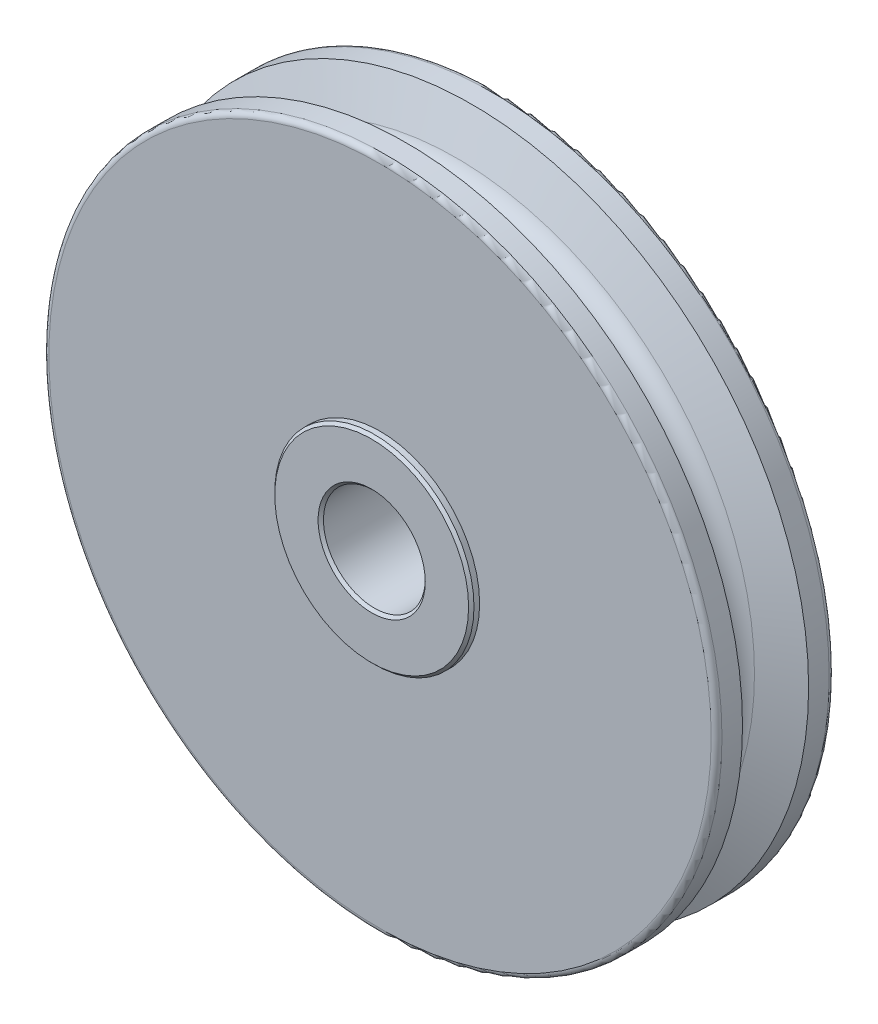
ISO-10303-21;
HEADER;
FILE_DESCRIPTION(('STEP AP214'),'2;1');
FILE_NAME('part.step','',(''),(''),'','','');
FILE_SCHEMA(('AUTOMOTIVE_DESIGN { 1 0 10303 214 1 1 1 1 }'));
ENDSEC;
DATA;
#1=APPLICATION_CONTEXT('core data for automotive mechanical design processes');
#2=APPLICATION_PROTOCOL_DEFINITION('international standard','automotive_design',2000,#1);
#3=PRODUCT_CONTEXT('',#1,'mechanical');
#4=PRODUCT('Part','Part','',(#3));
#5=PRODUCT_RELATED_PRODUCT_CATEGORY('part','',(#4));
#6=PRODUCT_DEFINITION_FORMATION('','',#4);
#7=PRODUCT_DEFINITION_CONTEXT('part definition',#1,'design');
#8=PRODUCT_DEFINITION('design','',#6,#7);
#9=PRODUCT_DEFINITION_SHAPE('','',#8);
#10=(LENGTH_UNIT() NAMED_UNIT(*) SI_UNIT(.MILLI.,.METRE.));
#11=(NAMED_UNIT(*) PLANE_ANGLE_UNIT() SI_UNIT($,.RADIAN.));
#12=(NAMED_UNIT(*) SI_UNIT($,.STERADIAN.) SOLID_ANGLE_UNIT());
#13=UNCERTAINTY_MEASURE_WITH_UNIT(LENGTH_MEASURE(1.E-05),#10,'distance_accuracy_value','');
#14=(GEOMETRIC_REPRESENTATION_CONTEXT(3) GLOBAL_UNCERTAINTY_ASSIGNED_CONTEXT((#13)) GLOBAL_UNIT_ASSIGNED_CONTEXT((#10,
#11,#12)) REPRESENTATION_CONTEXT('',''));
#15=CARTESIAN_POINT('',(0.,0.,0.));
#16=DIRECTION('',(0.,0.,1.));
#17=DIRECTION('',(1.,0.,0.));
#18=AXIS2_PLACEMENT_3D('',#15,#16,#17);
#19=CARTESIAN_POINT('',(0.,4.699,2.7813));
#20=DIRECTION('',(0.,0.,-1.));
#21=DIRECTION('',(-1.,0.,0.));
#22=AXIS2_PLACEMENT_3D('',#19,#20,#21);
#23=PLANE('',#22);
#24=CARTESIAN_POINT('',(0.,0.,2.7813));
#25=DIRECTION('',(0.,0.,1.));
#26=DIRECTION('',(1.,0.,0.));
#27=AXIS2_PLACEMENT_3D('',#24,#25,#26);
#28=CIRCLE('',#27,4.699);
#29=CARTESIAN_POINT('',(4.699,0.,2.7813));
#30=VERTEX_POINT('',#29);
#31=EDGE_CURVE('E74',#30,#30,#28,.T.);
#32=ORIENTED_EDGE('',*,*,#31,.F.);
#33=EDGE_LOOP('',(#32));
#34=FACE_BOUND('',#33,.T.);
#35=CARTESIAN_POINT('',(0.,0.,2.7813));
#36=DIRECTION('',(0.,0.,1.));
#37=DIRECTION('',(1.,0.,0.));
#38=AXIS2_PLACEMENT_3D('',#35,#36,#37);
#39=CIRCLE('',#38,15.621);
#40=CARTESIAN_POINT('',(15.621,0.,2.7813));
#41=VERTEX_POINT('',#40);
#42=EDGE_CURVE('E11',#41,#41,#39,.T.);
#43=ORIENTED_EDGE('',*,*,#42,.T.);
#44=EDGE_LOOP('',(#43));
#45=FACE_BOUND('',#44,.T.);
#46=ADVANCED_FACE('F40',(#34,#45),#23,.F.);
#47=CARTESIAN_POINT('',(0.,0.,2.5273));
#48=DIRECTION('',(0.,0.,1.));
#49=DIRECTION('',(1.,0.,0.));
#50=AXIS2_PLACEMENT_3D('',#47,#48,#49);
#51=TOROIDAL_SURFACE('',#50,15.621,0.253999999999999);
#52=ORIENTED_EDGE('',*,*,#42,.F.);
#53=EDGE_LOOP('',(#52));
#54=FACE_BOUND('',#53,.T.);
#55=CARTESIAN_POINT('',(0.,0.,2.5273));
#56=DIRECTION('',(0.,0.,1.));
#57=DIRECTION('',(1.,0.,0.));
#58=AXIS2_PLACEMENT_3D('',#55,#56,#57);
#59=CIRCLE('',#58,15.875);
#60=CARTESIAN_POINT('',(15.875,0.,2.5273));
#61=VERTEX_POINT('',#60);
#62=EDGE_CURVE('E46',#61,#61,#59,.T.);
#63=ORIENTED_EDGE('',*,*,#62,.T.);
#64=EDGE_LOOP('',(#63));
#65=FACE_BOUND('',#64,.T.);
#66=ADVANCED_FACE('F81',(#54,#65),#51,.T.);
#67=CARTESIAN_POINT('',(0.,0.,3.175));
#68=DIRECTION('',(0.,0.,1.));
#69=DIRECTION('',(1.,0.,0.));
#70=AXIS2_PLACEMENT_3D('',#67,#68,#69);
#71=CYLINDRICAL_SURFACE('',#70,15.875);
#72=ORIENTED_EDGE('',*,*,#62,.F.);
#73=EDGE_LOOP('',(#72));
#74=FACE_BOUND('',#73,.T.);
#75=CARTESIAN_POINT('',(0.,0.,1.55915995520883));
#76=DIRECTION('',(0.,0.,1.));
#77=DIRECTION('',(1.,0.,0.));
#78=AXIS2_PLACEMENT_3D('',#75,#76,#77);
#79=CIRCLE('',#78,15.875);
#80=CARTESIAN_POINT('',(15.875,0.,1.55915995520883));
#81=VERTEX_POINT('',#80);
#82=EDGE_CURVE('E50',#81,#81,#79,.T.);
#83=ORIENTED_EDGE('',*,*,#82,.T.);
#84=EDGE_LOOP('',(#83));
#85=FACE_BOUND('',#84,.T.);
#86=ADVANCED_FACE('F85',(#74,#85),#71,.T.);
#87=CARTESIAN_POINT('',(0.,0.,0.82426644670987));
#88=DIRECTION('',(0.,0.,1.));
#89=DIRECTION('',(1.,0.,0.));
#90=AXIS2_PLACEMENT_3D('',#87,#88,#89);
#91=CONICAL_SURFACE('',#90,14.0560747384533,1.18682389135614);
#92=ORIENTED_EDGE('',*,*,#82,.F.);
#93=EDGE_LOOP('',(#92));
#94=FACE_BOUND('',#93,.T.);
#95=CARTESIAN_POINT('',(0.,0.,0.82426644670987));
#96=DIRECTION('',(0.,0.,1.));
#97=DIRECTION('',(1.,0.,0.));
#98=AXIS2_PLACEMENT_3D('',#95,#96,#97);
#99=CIRCLE('',#98,14.0560747384533);
#100=CARTESIAN_POINT('',(14.0560747384533,0.,0.82426644670987));
#101=VERTEX_POINT('',#100);
#102=EDGE_CURVE('E54',#101,#101,#99,.T.);
#103=ORIENTED_EDGE('',*,*,#102,.T.);
#104=EDGE_LOOP('',(#103));
#105=FACE_BOUND('',#104,.T.);
#106=ADVANCED_FACE('F90',(#94,#105),#91,.T.);
#107=CARTESIAN_POINT('',(0.,0.,0.));
#108=DIRECTION('',(0.,0.,1.));
#109=DIRECTION('',(1.,0.,0.));
#110=AXIS2_PLACEMENT_3D('',#107,#108,#109);
#111=TOROIDAL_SURFACE('',#110,14.3891,0.888999999999999);
#112=ORIENTED_EDGE('',*,*,#102,.F.);
#113=EDGE_LOOP('',(#112));
#114=FACE_BOUND('',#113,.T.);
#115=CARTESIAN_POINT('',(0.,0.,-0.824266446709875));
#116=DIRECTION('',(0.,0.,1.));
#117=DIRECTION('',(1.,0.,0.));
#118=AXIS2_PLACEMENT_3D('',#115,#116,#117);
#119=CIRCLE('',#118,14.0560747384533);
#120=CARTESIAN_POINT('',(14.0560747384533,0.,-0.824266446709875));
#121=VERTEX_POINT('',#120);
#122=EDGE_CURVE('E59',#121,#121,#119,.T.);
#123=ORIENTED_EDGE('',*,*,#122,.T.);
#124=EDGE_LOOP('',(#123));
#125=FACE_BOUND('',#124,.T.);
#126=ADVANCED_FACE('F96',(#114,#125),#111,.F.);
#127=CARTESIAN_POINT('',(0.,0.,-1.55915995520883));
#128=DIRECTION('',(0.,0.,-1.));
#129=DIRECTION('',(-1.,0.,0.));
#130=AXIS2_PLACEMENT_3D('',#127,#128,#129);
#131=CONICAL_SURFACE('',#130,15.875,1.18682389135614);
#132=ORIENTED_EDGE('',*,*,#122,.F.);
#133=EDGE_LOOP('',(#132));
#134=FACE_BOUND('',#133,.T.);
#135=CARTESIAN_POINT('',(0.,0.,-1.55915995520883));
#136=DIRECTION('',(0.,0.,1.));
#137=DIRECTION('',(1.,0.,0.));
#138=AXIS2_PLACEMENT_3D('',#135,#136,#137);
#139=CIRCLE('',#138,15.875);
#140=CARTESIAN_POINT('',(15.875,0.,-1.55915995520883));
#141=VERTEX_POINT('',#140);
#142=EDGE_CURVE('E62',#141,#141,#139,.T.);
#143=ORIENTED_EDGE('',*,*,#142,.T.);
#144=EDGE_LOOP('',(#143));
#145=FACE_BOUND('',#144,.T.);
#146=ADVANCED_FACE('F100',(#134,#145),#131,.T.);
#147=CARTESIAN_POINT('',(0.,0.,3.175));
#148=DIRECTION('',(0.,0.,1.));
#149=DIRECTION('',(1.,0.,0.));
#150=AXIS2_PLACEMENT_3D('',#147,#148,#149);
#151=CYLINDRICAL_SURFACE('',#150,15.875);
#152=ORIENTED_EDGE('',*,*,#142,.F.);
#153=EDGE_LOOP('',(#152));
#154=FACE_BOUND('',#153,.T.);
#155=CARTESIAN_POINT('',(0.,0.,-2.5273));
#156=DIRECTION('',(0.,0.,1.));
#157=DIRECTION('',(1.,0.,0.));
#158=AXIS2_PLACEMENT_3D('',#155,#156,#157);
#159=CIRCLE('',#158,15.875);
#160=CARTESIAN_POINT('',(15.875,0.,-2.5273));
#161=VERTEX_POINT('',#160);
#162=EDGE_CURVE('E65',#161,#161,#159,.T.);
#163=ORIENTED_EDGE('',*,*,#162,.T.);
#164=EDGE_LOOP('',(#163));
#165=FACE_BOUND('',#164,.T.);
#166=ADVANCED_FACE('F104',(#154,#165),#151,.T.);
#167=CARTESIAN_POINT('',(0.,0.,-2.5273));
#168=DIRECTION('',(0.,0.,1.));
#169=DIRECTION('',(1.,0.,0.));
#170=AXIS2_PLACEMENT_3D('',#167,#168,#169);
#171=TOROIDAL_SURFACE('',#170,15.621,0.254000000000001);
#172=ORIENTED_EDGE('',*,*,#162,.F.);
#173=EDGE_LOOP('',(#172));
#174=FACE_BOUND('',#173,.T.);
#175=CARTESIAN_POINT('',(0.,0.,-2.7813));
#176=DIRECTION('',(0.,0.,1.));
#177=DIRECTION('',(1.,0.,0.));
#178=AXIS2_PLACEMENT_3D('',#175,#176,#177);
#179=CIRCLE('',#178,15.621);
#180=CARTESIAN_POINT('',(15.621,0.,-2.7813));
#181=VERTEX_POINT('',#180);
#182=EDGE_CURVE('E68',#181,#181,#179,.T.);
#183=ORIENTED_EDGE('',*,*,#182,.T.);
#184=EDGE_LOOP('',(#183));
#185=FACE_BOUND('',#184,.T.);
#186=ADVANCED_FACE('F108',(#174,#185),#171,.T.);
#187=CARTESIAN_POINT('',(0.,4.699,-2.7813));
#188=DIRECTION('',(0.,0.,1.));
#189=DIRECTION('',(1.,0.,0.));
#190=AXIS2_PLACEMENT_3D('',#187,#188,#189);
#191=PLANE('',#190);
#192=ORIENTED_EDGE('',*,*,#182,.F.);
#193=EDGE_LOOP('',(#192));
#194=FACE_BOUND('',#193,.T.);
#195=CARTESIAN_POINT('',(0.,0.,-2.7813));
#196=DIRECTION('',(0.,0.,1.));
#197=DIRECTION('',(1.,0.,0.));
#198=AXIS2_PLACEMENT_3D('',#195,#196,#197);
#199=CIRCLE('',#198,4.699);
#200=CARTESIAN_POINT('',(4.699,0.,-2.7813));
#201=VERTEX_POINT('',#200);
#202=EDGE_CURVE('E71',#201,#201,#199,.T.);
#203=ORIENTED_EDGE('',*,*,#202,.T.);
#204=EDGE_LOOP('',(#203));
#205=FACE_BOUND('',#204,.T.);
#206=ADVANCED_FACE('F112',(#194,#205),#191,.F.);
#207=CARTESIAN_POINT('',(0.,0.,3.175));
#208=DIRECTION('',(0.,0.,1.));
#209=DIRECTION('',(1.,0.,0.));
#210=AXIS2_PLACEMENT_3D('',#207,#208,#209);
#211=CYLINDRICAL_SURFACE('',#210,4.699);
#212=ORIENTED_EDGE('',*,*,#202,.F.);
#213=EDGE_LOOP('',(#212));
#214=FACE_BOUND('',#213,.T.);
#215=ORIENTED_EDGE('',*,*,#31,.T.);
#216=EDGE_LOOP('',(#215));
#217=FACE_BOUND('',#216,.T.);
#218=ADVANCED_FACE('F78',(#214,#217),#211,.F.);
#219=CLOSED_SHELL('',(#46,#66,#86,#106,#126,#146,#166,#186,#206,#218));
#220=MANIFOLD_SOLID_BREP('B2',#219);
#221=CARTESIAN_POINT('',(0.,0.,3.048));
#222=DIRECTION('',(0.,0.,-1.));
#223=DIRECTION('',(-1.,0.,0.));
#224=AXIS2_PLACEMENT_3D('',#221,#222,#223);
#225=CONICAL_SURFACE('',#224,4.699,0.78539816339745);
#226=CARTESIAN_POINT('',(0.,0.,3.175));
#227=DIRECTION('',(0.,0.,1.));
#228=DIRECTION('',(1.,0.,0.));
#229=AXIS2_PLACEMENT_3D('',#226,#227,#228);
#230=CIRCLE('',#229,4.572);
#231=CARTESIAN_POINT('',(4.572,0.,3.175));
#232=VERTEX_POINT('',#231);
#233=EDGE_CURVE('E39',#232,#232,#230,.T.);
#234=ORIENTED_EDGE('',*,*,#233,.F.);
#235=EDGE_LOOP('',(#234));
#236=FACE_BOUND('',#235,.T.);
#237=CARTESIAN_POINT('',(0.,0.,3.048));
#238=DIRECTION('',(0.,0.,1.));
#239=DIRECTION('',(1.,0.,0.));
#240=AXIS2_PLACEMENT_3D('',#237,#238,#239);
#241=CIRCLE('',#240,4.699);
#242=CARTESIAN_POINT('',(4.699,0.,3.048));
#243=VERTEX_POINT('',#242);
#244=EDGE_CURVE('E219',#243,#243,#241,.T.);
#245=ORIENTED_EDGE('',*,*,#244,.T.);
#246=EDGE_LOOP('',(#245));
#247=FACE_BOUND('',#246,.T.);
#248=ADVANCED_FACE('F191',(#236,#247),#225,.T.);
#249=CARTESIAN_POINT('',(0.,4.572,3.175));
#250=DIRECTION('',(0.,0.,-1.));
#251=DIRECTION('',(-1.,0.,0.));
#252=AXIS2_PLACEMENT_3D('',#249,#250,#251);
#253=PLANE('',#252);
#254=CARTESIAN_POINT('',(0.,0.,3.175));
#255=DIRECTION('',(0.,0.,1.));
#256=DIRECTION('',(1.,0.,0.));
#257=AXIS2_PLACEMENT_3D('',#254,#255,#256);
#258=CIRCLE('',#257,2.5273);
#259=CARTESIAN_POINT('',(2.5273,0.,3.175));
#260=VERTEX_POINT('',#259);
#261=EDGE_CURVE('E197',#260,#260,#258,.T.);
#262=ORIENTED_EDGE('',*,*,#261,.F.);
#263=EDGE_LOOP('',(#262));
#264=FACE_BOUND('',#263,.T.);
#265=ORIENTED_EDGE('',*,*,#233,.T.);
#266=EDGE_LOOP('',(#265));
#267=FACE_BOUND('',#266,.T.);
#268=ADVANCED_FACE('F256',(#264,#267),#253,.F.);
#269=CARTESIAN_POINT('',(0.,0.,3.175));
#270=DIRECTION('',(0.,0.,1.));
#271=DIRECTION('',(1.,0.,0.));
#272=AXIS2_PLACEMENT_3D('',#269,#270,#271);
#273=CONICAL_SURFACE('',#272,2.5273,0.785398163397447);
#274=CARTESIAN_POINT('',(0.,0.,3.048));
#275=DIRECTION('',(0.,0.,1.));
#276=DIRECTION('',(1.,0.,0.));
#277=AXIS2_PLACEMENT_3D('',#274,#275,#276);
#278=CIRCLE('',#277,2.4003);
#279=CARTESIAN_POINT('',(2.4003,0.,3.048));
#280=VERTEX_POINT('',#279);
#281=EDGE_CURVE('E201',#280,#280,#278,.T.);
#282=ORIENTED_EDGE('',*,*,#281,.F.);
#283=EDGE_LOOP('',(#282));
#284=FACE_BOUND('',#283,.T.);
#285=ORIENTED_EDGE('',*,*,#261,.T.);
#286=EDGE_LOOP('',(#285));
#287=FACE_BOUND('',#286,.T.);
#288=ADVANCED_FACE('F251',(#284,#287),#273,.F.);
#289=CARTESIAN_POINT('',(0.,0.,3.175));
#290=DIRECTION('',(0.,0.,1.));
#291=DIRECTION('',(1.,0.,0.));
#292=AXIS2_PLACEMENT_3D('',#289,#290,#291);
#293=CYLINDRICAL_SURFACE('',#292,2.4003);
#294=CARTESIAN_POINT('',(0.,0.,-3.048));
#295=DIRECTION('',(0.,0.,1.));
#296=DIRECTION('',(1.,0.,0.));
#297=AXIS2_PLACEMENT_3D('',#294,#295,#296);
#298=CIRCLE('',#297,2.4003);
#299=CARTESIAN_POINT('',(2.4003,0.,-3.048));
#300=VERTEX_POINT('',#299);
#301=EDGE_CURVE('E205',#300,#300,#298,.T.);
#302=ORIENTED_EDGE('',*,*,#301,.F.);
#303=EDGE_LOOP('',(#302));
#304=FACE_BOUND('',#303,.T.);
#305=ORIENTED_EDGE('',*,*,#281,.T.);
#306=EDGE_LOOP('',(#305));
#307=FACE_BOUND('',#306,.T.);
#308=ADVANCED_FACE('F245',(#304,#307),#293,.F.);
#309=CARTESIAN_POINT('',(0.,0.,-3.048));
#310=DIRECTION('',(0.,0.,-1.));
#311=DIRECTION('',(-1.,0.,0.));
#312=AXIS2_PLACEMENT_3D('',#309,#310,#311);
#313=CONICAL_SURFACE('',#312,2.4003,0.785398163397447);
#314=CARTESIAN_POINT('',(0.,0.,-3.175));
#315=DIRECTION('',(0.,0.,1.));
#316=DIRECTION('',(1.,0.,0.));
#317=AXIS2_PLACEMENT_3D('',#314,#315,#316);
#318=CIRCLE('',#317,2.5273);
#319=CARTESIAN_POINT('',(2.5273,0.,-3.175));
#320=VERTEX_POINT('',#319);
#321=EDGE_CURVE('E210',#320,#320,#318,.T.);
#322=ORIENTED_EDGE('',*,*,#321,.F.);
#323=EDGE_LOOP('',(#322));
#324=FACE_BOUND('',#323,.T.);
#325=ORIENTED_EDGE('',*,*,#301,.T.);
#326=EDGE_LOOP('',(#325));
#327=FACE_BOUND('',#326,.T.);
#328=ADVANCED_FACE('F239',(#324,#327),#313,.F.);
#329=CARTESIAN_POINT('',(0.,2.5273,-3.175));
#330=DIRECTION('',(0.,0.,1.));
#331=DIRECTION('',(1.,0.,0.));
#332=AXIS2_PLACEMENT_3D('',#329,#330,#331);
#333=PLANE('',#332);
#334=CARTESIAN_POINT('',(0.,0.,-3.175));
#335=DIRECTION('',(0.,0.,1.));
#336=DIRECTION('',(1.,0.,0.));
#337=AXIS2_PLACEMENT_3D('',#334,#335,#336);
#338=CIRCLE('',#337,4.572);
#339=CARTESIAN_POINT('',(4.572,0.,-3.175));
#340=VERTEX_POINT('',#339);
#341=EDGE_CURVE('E213',#340,#340,#338,.T.);
#342=ORIENTED_EDGE('',*,*,#341,.F.);
#343=EDGE_LOOP('',(#342));
#344=FACE_BOUND('',#343,.T.);
#345=ORIENTED_EDGE('',*,*,#321,.T.);
#346=EDGE_LOOP('',(#345));
#347=FACE_BOUND('',#346,.T.);
#348=ADVANCED_FACE('F233',(#344,#347),#333,.F.);
#349=CARTESIAN_POINT('',(0.,0.,-3.175));
#350=DIRECTION('',(0.,0.,1.));
#351=DIRECTION('',(1.,0.,0.));
#352=AXIS2_PLACEMENT_3D('',#349,#350,#351);
#353=CONICAL_SURFACE('',#352,4.572,0.785398163397448);
#354=CARTESIAN_POINT('',(0.,0.,-3.048));
#355=DIRECTION('',(0.,0.,1.));
#356=DIRECTION('',(1.,0.,0.));
#357=AXIS2_PLACEMENT_3D('',#354,#355,#356);
#358=CIRCLE('',#357,4.699);
#359=CARTESIAN_POINT('',(4.699,0.,-3.048));
#360=VERTEX_POINT('',#359);
#361=EDGE_CURVE('E216',#360,#360,#358,.T.);
#362=ORIENTED_EDGE('',*,*,#361,.F.);
#363=EDGE_LOOP('',(#362));
#364=FACE_BOUND('',#363,.T.);
#365=ORIENTED_EDGE('',*,*,#341,.T.);
#366=EDGE_LOOP('',(#365));
#367=FACE_BOUND('',#366,.T.);
#368=ADVANCED_FACE('F227',(#364,#367),#353,.T.);
#369=CARTESIAN_POINT('',(0.,0.,3.175));
#370=DIRECTION('',(0.,0.,1.));
#371=DIRECTION('',(1.,0.,0.));
#372=AXIS2_PLACEMENT_3D('',#369,#370,#371);
#373=CYLINDRICAL_SURFACE('',#372,4.699);
#374=ORIENTED_EDGE('',*,*,#244,.F.);
#375=EDGE_LOOP('',(#374));
#376=FACE_BOUND('',#375,.T.);
#377=ORIENTED_EDGE('',*,*,#361,.T.);
#378=EDGE_LOOP('',(#377));
#379=FACE_BOUND('',#378,.T.);
#380=ADVANCED_FACE('F224',(#376,#379),#373,.T.);
#381=CLOSED_SHELL('',(#248,#268,#288,#308,#328,#348,#368,#380));
#382=MANIFOLD_SOLID_BREP('B6',#381);
#383=ADVANCED_BREP_SHAPE_REPRESENTATION('',(#18,#220,#382),#14);
#384=SHAPE_DEFINITION_REPRESENTATION(#9,#383);
ENDSEC;
END-ISO-10303-21;
